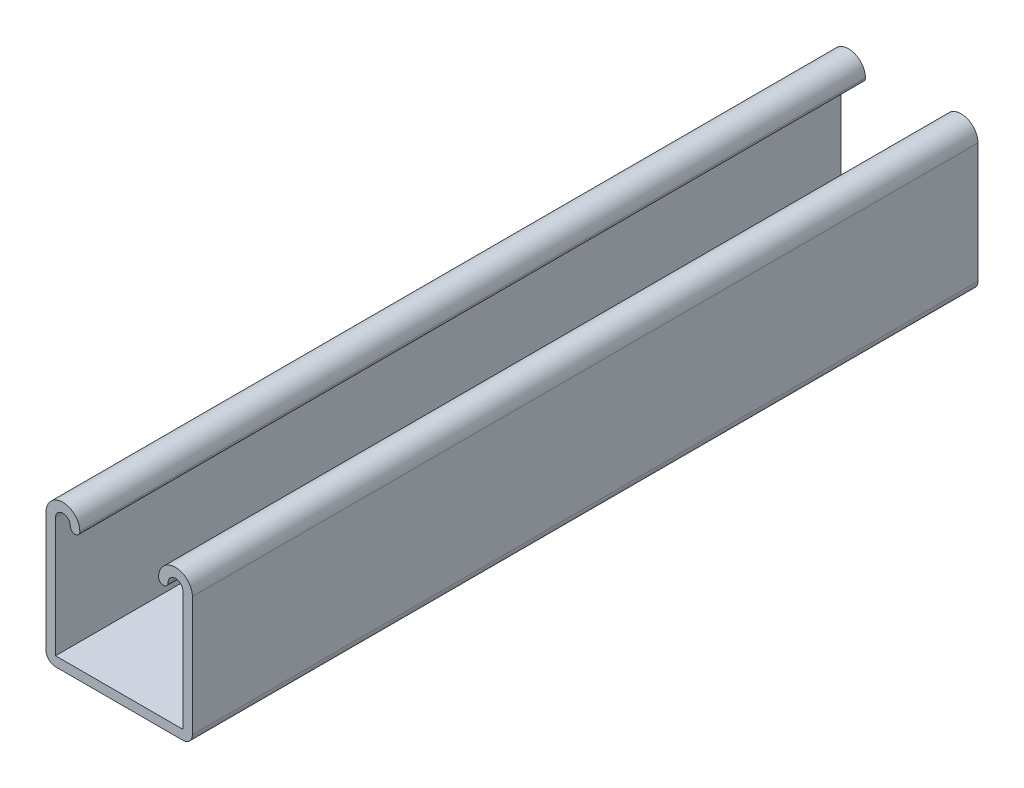
ISO-10303-21;
HEADER;
FILE_DESCRIPTION(('STEP AP214'),'2;1');
FILE_NAME('part.step','',(''),(''),'','','');
FILE_SCHEMA(('AUTOMOTIVE_DESIGN { 1 0 10303 214 1 1 1 1 }'));
ENDSEC;
DATA;
#1=APPLICATION_CONTEXT('core data for automotive mechanical design processes');
#2=APPLICATION_PROTOCOL_DEFINITION('international standard','automotive_design',2000,#1);
#3=PRODUCT_CONTEXT('',#1,'mechanical');
#4=PRODUCT('Part','Part','',(#3));
#5=PRODUCT_RELATED_PRODUCT_CATEGORY('part','',(#4));
#6=PRODUCT_DEFINITION_FORMATION('','',#4);
#7=PRODUCT_DEFINITION_CONTEXT('part definition',#1,'design');
#8=PRODUCT_DEFINITION('design','',#6,#7);
#9=PRODUCT_DEFINITION_SHAPE('','',#8);
#10=(LENGTH_UNIT() NAMED_UNIT(*) SI_UNIT(.MILLI.,.METRE.));
#11=(NAMED_UNIT(*) PLANE_ANGLE_UNIT() SI_UNIT($,.RADIAN.));
#12=(NAMED_UNIT(*) SI_UNIT($,.STERADIAN.) SOLID_ANGLE_UNIT());
#13=UNCERTAINTY_MEASURE_WITH_UNIT(LENGTH_MEASURE(1.E-05),#10,'distance_accuracy_value','');
#14=(GEOMETRIC_REPRESENTATION_CONTEXT(3) GLOBAL_UNCERTAINTY_ASSIGNED_CONTEXT((#13)) GLOBAL_UNIT_ASSIGNED_CONTEXT((#10,
#11,#12)) REPRESENTATION_CONTEXT('',''));
#15=CARTESIAN_POINT('',(0.,0.,0.));
#16=DIRECTION('',(0.,0.,1.));
#17=DIRECTION('',(1.,0.,0.));
#18=AXIS2_PLACEMENT_3D('',#15,#16,#17);
#19=CARTESIAN_POINT('',(0.,2.6924,221.996));
#20=DIRECTION('',(0.,0.,-1.));
#21=DIRECTION('',(-1.,0.,0.));
#22=AXIS2_PLACEMENT_3D('',#19,#20,#21);
#23=CYLINDRICAL_SURFACE('',#22,2.6924);
#24=CARTESIAN_POINT('',(0.,2.6924,0.));
#25=DIRECTION('',(0.,0.,1.));
#26=DIRECTION('',(-1.,0.,0.));
#27=AXIS2_PLACEMENT_3D('',#24,#25,#26);
#28=CIRCLE('',#27,2.6924);
#29=CARTESIAN_POINT('',(-2.6924,2.6924,0.));
#30=VERTEX_POINT('',#29);
#31=CARTESIAN_POINT('',(0.,0.,0.));
#32=VERTEX_POINT('',#31);
#33=EDGE_CURVE('E165',#30,#32,#28,.T.);
#34=ORIENTED_EDGE('',*,*,#33,.T.);
#35=DIRECTION('',(0.,0.,-1.));
#36=VECTOR('',#35,1.);
#37=CARTESIAN_POINT('',(0.,0.,221.996));
#38=LINE('',#37,#36);
#39=CARTESIAN_POINT('',(0.,0.,221.996));
#40=VERTEX_POINT('',#39);
#41=EDGE_CURVE('E11',#40,#32,#38,.T.);
#42=ORIENTED_EDGE('',*,*,#41,.F.);
#43=CARTESIAN_POINT('',(0.,2.6924,221.996));
#44=DIRECTION('',(0.,0.,1.));
#45=DIRECTION('',(-1.,0.,0.));
#46=AXIS2_PLACEMENT_3D('',#43,#44,#45);
#47=CIRCLE('',#46,2.6924);
#48=CARTESIAN_POINT('',(-2.6924,2.6924,221.996));
#49=VERTEX_POINT('',#48);
#50=EDGE_CURVE('E191',#49,#40,#47,.T.);
#51=ORIENTED_EDGE('',*,*,#50,.F.);
#52=DIRECTION('',(0.,0.,-1.));
#53=VECTOR('',#52,1.);
#54=CARTESIAN_POINT('',(-2.6924,2.6924,221.996));
#55=LINE('',#54,#53);
#56=EDGE_CURVE('E161',#49,#30,#55,.T.);
#57=ORIENTED_EDGE('',*,*,#56,.T.);
#58=EDGE_LOOP('',(#34,#42,#51,#57));
#59=FACE_BOUND('',#58,.T.);
#60=ADVANCED_FACE('F33',(#59),#23,.T.);
#61=CARTESIAN_POINT('',(0.,0.,221.996));
#62=DIRECTION('',(0.,1.,0.));
#63=DIRECTION('',(0.,0.,1.));
#64=AXIS2_PLACEMENT_3D('',#61,#62,#63);
#65=PLANE('',#64);
#66=DIRECTION('',(1.,0.,0.));
#67=VECTOR('',#66,1.);
#68=CARTESIAN_POINT('',(0.,0.,0.));
#69=LINE('',#68,#67);
#70=CARTESIAN_POINT('',(35.98,0.,0.));
#71=VERTEX_POINT('',#70);
#72=EDGE_CURVE('E168',#32,#71,#69,.T.);
#73=ORIENTED_EDGE('',*,*,#72,.T.);
#74=DIRECTION('',(0.,0.,-1.));
#75=VECTOR('',#74,1.);
#76=CARTESIAN_POINT('',(35.98,0.,221.996));
#77=LINE('',#76,#75);
#78=CARTESIAN_POINT('',(35.98,0.,221.996));
#79=VERTEX_POINT('',#78);
#80=EDGE_CURVE('E41',#79,#71,#77,.T.);
#81=ORIENTED_EDGE('',*,*,#80,.F.);
#82=DIRECTION('',(1.,0.,0.));
#83=VECTOR('',#82,1.);
#84=CARTESIAN_POINT('',(0.,0.,221.996));
#85=LINE('',#84,#83);
#86=EDGE_CURVE('E110',#40,#79,#85,.T.);
#87=ORIENTED_EDGE('',*,*,#86,.F.);
#88=ORIENTED_EDGE('',*,*,#41,.T.);
#89=EDGE_LOOP('',(#73,#81,#87,#88));
#90=FACE_BOUND('',#89,.T.);
#91=ADVANCED_FACE('F279',(#90),#65,.F.);
#92=CARTESIAN_POINT('',(35.98,2.6924,221.996));
#93=DIRECTION('',(0.,0.,-1.));
#94=DIRECTION('',(-1.,0.,0.));
#95=AXIS2_PLACEMENT_3D('',#92,#93,#94);
#96=CYLINDRICAL_SURFACE('',#95,2.6924);
#97=CARTESIAN_POINT('',(35.98,2.6924,0.));
#98=DIRECTION('',(0.,0.,1.));
#99=DIRECTION('',(1.,0.,0.));
#100=AXIS2_PLACEMENT_3D('',#97,#98,#99);
#101=CIRCLE('',#100,2.6924);
#102=CARTESIAN_POINT('',(38.6724,2.6924,0.));
#103=VERTEX_POINT('',#102);
#104=EDGE_CURVE('E170',#71,#103,#101,.T.);
#105=ORIENTED_EDGE('',*,*,#104,.T.);
#106=DIRECTION('',(0.,0.,-1.));
#107=VECTOR('',#106,1.);
#108=CARTESIAN_POINT('',(38.6724,2.6924,221.996));
#109=LINE('',#108,#107);
#110=CARTESIAN_POINT('',(38.6724,2.6924,221.996));
#111=VERTEX_POINT('',#110);
#112=EDGE_CURVE('E216',#111,#103,#109,.T.);
#113=ORIENTED_EDGE('',*,*,#112,.F.);
#114=CARTESIAN_POINT('',(35.98,2.6924,221.996));
#115=DIRECTION('',(0.,0.,1.));
#116=DIRECTION('',(1.,0.,0.));
#117=AXIS2_PLACEMENT_3D('',#114,#115,#116);
#118=CIRCLE('',#117,2.6924);
#119=EDGE_CURVE('E224',#79,#111,#118,.T.);
#120=ORIENTED_EDGE('',*,*,#119,.F.);
#121=ORIENTED_EDGE('',*,*,#80,.T.);
#122=EDGE_LOOP('',(#105,#113,#120,#121));
#123=FACE_BOUND('',#122,.T.);
#124=ADVANCED_FACE('F222',(#123),#96,.T.);
#125=CARTESIAN_POINT('',(38.6724,2.6924,221.996));
#126=DIRECTION('',(-1.,0.,0.));
#127=DIRECTION('',(0.,0.,1.));
#128=AXIS2_PLACEMENT_3D('',#125,#126,#127);
#129=PLANE('',#128);
#130=DIRECTION('',(0.,1.,0.));
#131=VECTOR('',#130,1.);
#132=CARTESIAN_POINT('',(38.6724,2.6924,0.));
#133=LINE('',#132,#131);
#134=CARTESIAN_POINT('',(38.6724,36.5252,0.));
#135=VERTEX_POINT('',#134);
#136=EDGE_CURVE('E172',#103,#135,#133,.T.);
#137=ORIENTED_EDGE('',*,*,#136,.T.);
#138=DIRECTION('',(0.,0.,-1.));
#139=VECTOR('',#138,1.);
#140=CARTESIAN_POINT('',(38.6724,36.5252,221.996));
#141=LINE('',#140,#139);
#142=CARTESIAN_POINT('',(38.6724,36.5252,221.996));
#143=VERTEX_POINT('',#142);
#144=EDGE_CURVE('E213',#143,#135,#141,.T.);
#145=ORIENTED_EDGE('',*,*,#144,.F.);
#146=DIRECTION('',(0.,1.,0.));
#147=VECTOR('',#146,1.);
#148=CARTESIAN_POINT('',(38.6724,2.6924,221.996));
#149=LINE('',#148,#147);
#150=EDGE_CURVE('E242',#111,#143,#149,.T.);
#151=ORIENTED_EDGE('',*,*,#150,.F.);
#152=ORIENTED_EDGE('',*,*,#112,.T.);
#153=EDGE_LOOP('',(#137,#145,#151,#152));
#154=FACE_BOUND('',#153,.T.);
#155=ADVANCED_FACE('F233',(#154),#129,.F.);
#156=CARTESIAN_POINT('',(33.8972,36.5252,221.996));
#157=DIRECTION('',(0.,0.,-1.));
#158=DIRECTION('',(-1.,0.,0.));
#159=AXIS2_PLACEMENT_3D('',#156,#157,#158);
#160=CYLINDRICAL_SURFACE('',#159,4.7752);
#161=CARTESIAN_POINT('',(33.8972,36.5252,0.));
#162=DIRECTION('',(0.,0.,1.));
#163=DIRECTION('',(1.,0.,0.));
#164=AXIS2_PLACEMENT_3D('',#161,#162,#163);
#165=CIRCLE('',#164,4.7752);
#166=CARTESIAN_POINT('',(29.122,36.5252,0.));
#167=VERTEX_POINT('',#166);
#168=EDGE_CURVE('E174',#135,#167,#165,.T.);
#169=ORIENTED_EDGE('',*,*,#168,.T.);
#170=DIRECTION('',(0.,0.,-1.));
#171=VECTOR('',#170,1.);
#172=CARTESIAN_POINT('',(29.122,36.5252,221.996));
#173=LINE('',#172,#171);
#174=CARTESIAN_POINT('',(29.122,36.5252,221.996));
#175=VERTEX_POINT('',#174);
#176=EDGE_CURVE('E210',#175,#167,#173,.T.);
#177=ORIENTED_EDGE('',*,*,#176,.F.);
#178=CARTESIAN_POINT('',(33.8972,36.5252,221.996));
#179=DIRECTION('',(0.,0.,1.));
#180=DIRECTION('',(1.,0.,0.));
#181=AXIS2_PLACEMENT_3D('',#178,#179,#180);
#182=CIRCLE('',#181,4.7752);
#183=EDGE_CURVE('E239',#143,#175,#182,.T.);
#184=ORIENTED_EDGE('',*,*,#183,.F.);
#185=ORIENTED_EDGE('',*,*,#144,.T.);
#186=EDGE_LOOP('',(#169,#177,#184,#185));
#187=FACE_BOUND('',#186,.T.);
#188=ADVANCED_FACE('F237',(#187),#160,.T.);
#189=CARTESIAN_POINT('',(30.4682,36.5252,221.996));
#190=DIRECTION('',(0.,0.,-1.));
#191=DIRECTION('',(-1.,0.,0.));
#192=AXIS2_PLACEMENT_3D('',#189,#190,#191);
#193=CYLINDRICAL_SURFACE('',#192,1.3462);
#194=CARTESIAN_POINT('',(30.4682,36.5252,0.));
#195=DIRECTION('',(0.,0.,1.));
#196=DIRECTION('',(1.,0.,0.));
#197=AXIS2_PLACEMENT_3D('',#194,#195,#196);
#198=CIRCLE('',#197,1.3462);
#199=CARTESIAN_POINT('',(31.8144,36.5252,0.));
#200=VERTEX_POINT('',#199);
#201=EDGE_CURVE('E176',#167,#200,#198,.T.);
#202=ORIENTED_EDGE('',*,*,#201,.T.);
#203=DIRECTION('',(0.,0.,-1.));
#204=VECTOR('',#203,1.);
#205=CARTESIAN_POINT('',(31.8144,36.5252,221.996));
#206=LINE('',#205,#204);
#207=CARTESIAN_POINT('',(31.8144,36.5252,221.996));
#208=VERTEX_POINT('',#207);
#209=EDGE_CURVE('E207',#208,#200,#206,.T.);
#210=ORIENTED_EDGE('',*,*,#209,.F.);
#211=CARTESIAN_POINT('',(30.4682,36.5252,221.996));
#212=DIRECTION('',(0.,0.,1.));
#213=DIRECTION('',(1.,0.,0.));
#214=AXIS2_PLACEMENT_3D('',#211,#212,#213);
#215=CIRCLE('',#214,1.3462);
#216=EDGE_CURVE('E241',#175,#208,#215,.T.);
#217=ORIENTED_EDGE('',*,*,#216,.F.);
#218=ORIENTED_EDGE('',*,*,#176,.T.);
#219=EDGE_LOOP('',(#202,#210,#217,#218));
#220=FACE_BOUND('',#219,.T.);
#221=ADVANCED_FACE('F292',(#220),#193,.T.);
#222=CARTESIAN_POINT('',(33.8972,36.5252,221.996));
#223=DIRECTION('',(0.,0.,-1.));
#224=DIRECTION('',(-1.,0.,0.));
#225=AXIS2_PLACEMENT_3D('',#222,#223,#224);
#226=CYLINDRICAL_SURFACE('',#225,2.0828);
#227=CARTESIAN_POINT('',(33.8972,36.5252,0.));
#228=DIRECTION('',(0.,0.,-1.));
#229=DIRECTION('',(1.,0.,0.));
#230=AXIS2_PLACEMENT_3D('',#227,#228,#229);
#231=CIRCLE('',#230,2.0828);
#232=CARTESIAN_POINT('',(35.98,36.5252,0.));
#233=VERTEX_POINT('',#232);
#234=EDGE_CURVE('E178',#200,#233,#231,.T.);
#235=ORIENTED_EDGE('',*,*,#234,.T.);
#236=DIRECTION('',(0.,0.,-1.));
#237=VECTOR('',#236,1.);
#238=CARTESIAN_POINT('',(35.98,36.5252,221.996));
#239=LINE('',#238,#237);
#240=CARTESIAN_POINT('',(35.98,36.5252,221.996));
#241=VERTEX_POINT('',#240);
#242=EDGE_CURVE('E204',#241,#233,#239,.T.);
#243=ORIENTED_EDGE('',*,*,#242,.F.);
#244=CARTESIAN_POINT('',(33.8972,36.5252,221.996));
#245=DIRECTION('',(0.,0.,-1.));
#246=DIRECTION('',(1.,0.,0.));
#247=AXIS2_PLACEMENT_3D('',#244,#245,#246);
#248=CIRCLE('',#247,2.0828);
#249=EDGE_CURVE('E244',#208,#241,#248,.T.);
#250=ORIENTED_EDGE('',*,*,#249,.F.);
#251=ORIENTED_EDGE('',*,*,#209,.T.);
#252=EDGE_LOOP('',(#235,#243,#250,#251));
#253=FACE_BOUND('',#252,.T.);
#254=ADVANCED_FACE('F295',(#253),#226,.F.);
#255=CARTESIAN_POINT('',(35.98,2.6924,221.996));
#256=DIRECTION('',(1.,0.,0.));
#257=DIRECTION('',(0.,0.,-1.));
#258=AXIS2_PLACEMENT_3D('',#255,#256,#257);
#259=PLANE('',#258);
#260=DIRECTION('',(0.,-1.,0.));
#261=VECTOR('',#260,1.);
#262=CARTESIAN_POINT('',(35.98,2.6924,0.));
#263=LINE('',#262,#261);
#264=CARTESIAN_POINT('',(35.98,2.6924,0.));
#265=VERTEX_POINT('',#264);
#266=EDGE_CURVE('E180',#233,#265,#263,.T.);
#267=ORIENTED_EDGE('',*,*,#266,.T.);
#268=DIRECTION('',(0.,0.,-1.));
#269=VECTOR('',#268,1.);
#270=CARTESIAN_POINT('',(35.98,2.6924,221.996));
#271=LINE('',#270,#269);
#272=CARTESIAN_POINT('',(35.98,2.6924,221.996));
#273=VERTEX_POINT('',#272);
#274=EDGE_CURVE('E201',#273,#265,#271,.T.);
#275=ORIENTED_EDGE('',*,*,#274,.F.);
#276=DIRECTION('',(0.,-1.,0.));
#277=VECTOR('',#276,1.);
#278=CARTESIAN_POINT('',(35.98,2.6924,221.996));
#279=LINE('',#278,#277);
#280=EDGE_CURVE('E250',#241,#273,#279,.T.);
#281=ORIENTED_EDGE('',*,*,#280,.F.);
#282=ORIENTED_EDGE('',*,*,#242,.T.);
#283=EDGE_LOOP('',(#267,#275,#281,#282));
#284=FACE_BOUND('',#283,.T.);
#285=ADVANCED_FACE('F299',(#284),#259,.F.);
#286=CARTESIAN_POINT('',(35.98,2.6924,221.996));
#287=DIRECTION('',(0.,-1.,0.));
#288=DIRECTION('',(0.,0.,-1.));
#289=AXIS2_PLACEMENT_3D('',#286,#287,#288);
#290=PLANE('',#289);
#291=DIRECTION('',(-1.,0.,0.));
#292=VECTOR('',#291,1.);
#293=CARTESIAN_POINT('',(35.98,2.6924,0.));
#294=LINE('',#293,#292);
#295=CARTESIAN_POINT('',(0.,2.6924,0.));
#296=VERTEX_POINT('',#295);
#297=EDGE_CURVE('E182',#265,#296,#294,.T.);
#298=ORIENTED_EDGE('',*,*,#297,.T.);
#299=DIRECTION('',(0.,0.,-1.));
#300=VECTOR('',#299,1.);
#301=CARTESIAN_POINT('',(0.,2.6924,221.996));
#302=LINE('',#301,#300);
#303=CARTESIAN_POINT('',(0.,2.6924,221.996));
#304=VERTEX_POINT('',#303);
#305=EDGE_CURVE('E198',#304,#296,#302,.T.);
#306=ORIENTED_EDGE('',*,*,#305,.F.);
#307=DIRECTION('',(-1.,0.,0.));
#308=VECTOR('',#307,1.);
#309=CARTESIAN_POINT('',(35.98,2.6924,221.996));
#310=LINE('',#309,#308);
#311=EDGE_CURVE('E252',#273,#304,#310,.T.);
#312=ORIENTED_EDGE('',*,*,#311,.F.);
#313=ORIENTED_EDGE('',*,*,#274,.T.);
#314=EDGE_LOOP('',(#298,#306,#312,#313));
#315=FACE_BOUND('',#314,.T.);
#316=ADVANCED_FACE('F303',(#315),#290,.F.);
#317=CARTESIAN_POINT('',(0.,2.6924,221.996));
#318=DIRECTION('',(-1.,0.,0.));
#319=DIRECTION('',(0.,0.,1.));
#320=AXIS2_PLACEMENT_3D('',#317,#318,#319);
#321=PLANE('',#320);
#322=DIRECTION('',(0.,1.,0.));
#323=VECTOR('',#322,1.);
#324=CARTESIAN_POINT('',(0.,2.6924,0.));
#325=LINE('',#324,#323);
#326=CARTESIAN_POINT('',(0.,36.5252,0.));
#327=VERTEX_POINT('',#326);
#328=EDGE_CURVE('E184',#296,#327,#325,.T.);
#329=ORIENTED_EDGE('',*,*,#328,.T.);
#330=DIRECTION('',(0.,0.,-1.));
#331=VECTOR('',#330,1.);
#332=CARTESIAN_POINT('',(0.,36.5252,221.996));
#333=LINE('',#332,#331);
#334=CARTESIAN_POINT('',(0.,36.5252,221.996));
#335=VERTEX_POINT('',#334);
#336=EDGE_CURVE('E195',#335,#327,#333,.T.);
#337=ORIENTED_EDGE('',*,*,#336,.F.);
#338=DIRECTION('',(0.,1.,0.));
#339=VECTOR('',#338,1.);
#340=CARTESIAN_POINT('',(0.,2.6924,221.996));
#341=LINE('',#340,#339);
#342=EDGE_CURVE('E254',#304,#335,#341,.T.);
#343=ORIENTED_EDGE('',*,*,#342,.F.);
#344=ORIENTED_EDGE('',*,*,#305,.T.);
#345=EDGE_LOOP('',(#329,#337,#343,#344));
#346=FACE_BOUND('',#345,.T.);
#347=ADVANCED_FACE('F260',(#346),#321,.F.);
#348=CARTESIAN_POINT('',(2.0828,36.5252,221.996));
#349=DIRECTION('',(0.,0.,-1.));
#350=DIRECTION('',(-1.,0.,0.));
#351=AXIS2_PLACEMENT_3D('',#348,#349,#350);
#352=CYLINDRICAL_SURFACE('',#351,2.0828);
#353=CARTESIAN_POINT('',(2.0828,36.5252,0.));
#354=DIRECTION('',(0.,0.,-1.));
#355=DIRECTION('',(-1.,0.,0.));
#356=AXIS2_PLACEMENT_3D('',#353,#354,#355);
#357=CIRCLE('',#356,2.0828);
#358=CARTESIAN_POINT('',(4.16560000000001,36.5252,0.));
#359=VERTEX_POINT('',#358);
#360=EDGE_CURVE('E186',#327,#359,#357,.T.);
#361=ORIENTED_EDGE('',*,*,#360,.T.);
#362=DIRECTION('',(0.,0.,-1.));
#363=VECTOR('',#362,1.);
#364=CARTESIAN_POINT('',(4.16560000000001,36.5252,221.996));
#365=LINE('',#364,#363);
#366=CARTESIAN_POINT('',(4.16560000000001,36.5252,221.996));
#367=VERTEX_POINT('',#366);
#368=EDGE_CURVE('E156',#367,#359,#365,.T.);
#369=ORIENTED_EDGE('',*,*,#368,.F.);
#370=CARTESIAN_POINT('',(2.0828,36.5252,221.996));
#371=DIRECTION('',(0.,0.,-1.));
#372=DIRECTION('',(-1.,0.,0.));
#373=AXIS2_PLACEMENT_3D('',#370,#371,#372);
#374=CIRCLE('',#373,2.0828);
#375=EDGE_CURVE('E147',#335,#367,#374,.T.);
#376=ORIENTED_EDGE('',*,*,#375,.F.);
#377=ORIENTED_EDGE('',*,*,#336,.T.);
#378=EDGE_LOOP('',(#361,#369,#376,#377));
#379=FACE_BOUND('',#378,.T.);
#380=ADVANCED_FACE('F264',(#379),#352,.F.);
#381=CARTESIAN_POINT('',(5.5118,36.5252,221.996));
#382=DIRECTION('',(0.,0.,-1.));
#383=DIRECTION('',(-1.,0.,0.));
#384=AXIS2_PLACEMENT_3D('',#381,#382,#383);
#385=CYLINDRICAL_SURFACE('',#384,1.3462);
#386=CARTESIAN_POINT('',(5.5118,36.5252,0.));
#387=DIRECTION('',(0.,0.,1.));
#388=DIRECTION('',(-1.,0.,0.));
#389=AXIS2_PLACEMENT_3D('',#386,#387,#388);
#390=CIRCLE('',#389,1.3462);
#391=CARTESIAN_POINT('',(6.858,36.5252,0.));
#392=VERTEX_POINT('',#391);
#393=EDGE_CURVE('E155',#359,#392,#390,.T.);
#394=ORIENTED_EDGE('',*,*,#393,.T.);
#395=DIRECTION('',(0.,0.,-1.));
#396=VECTOR('',#395,1.);
#397=CARTESIAN_POINT('',(6.858,36.5252,221.996));
#398=LINE('',#397,#396);
#399=CARTESIAN_POINT('',(6.858,36.5252,221.996));
#400=VERTEX_POINT('',#399);
#401=EDGE_CURVE('E152',#400,#392,#398,.T.);
#402=ORIENTED_EDGE('',*,*,#401,.F.);
#403=CARTESIAN_POINT('',(5.5118,36.5252,221.996));
#404=DIRECTION('',(0.,0.,1.));
#405=DIRECTION('',(-1.,0.,0.));
#406=AXIS2_PLACEMENT_3D('',#403,#404,#405);
#407=CIRCLE('',#406,1.3462);
#408=EDGE_CURVE('E141',#367,#400,#407,.T.);
#409=ORIENTED_EDGE('',*,*,#408,.F.);
#410=ORIENTED_EDGE('',*,*,#368,.T.);
#411=EDGE_LOOP('',(#394,#402,#409,#410));
#412=FACE_BOUND('',#411,.T.);
#413=ADVANCED_FACE('F153',(#412),#385,.T.);
#414=CARTESIAN_POINT('',(2.0828,36.5252,221.996));
#415=DIRECTION('',(0.,0.,-1.));
#416=DIRECTION('',(-1.,0.,0.));
#417=AXIS2_PLACEMENT_3D('',#414,#415,#416);
#418=CYLINDRICAL_SURFACE('',#417,4.7752);
#419=CARTESIAN_POINT('',(2.0828,36.5252,0.));
#420=DIRECTION('',(0.,0.,1.));
#421=DIRECTION('',(-1.,0.,0.));
#422=AXIS2_PLACEMENT_3D('',#419,#420,#421);
#423=CIRCLE('',#422,4.7752);
#424=CARTESIAN_POINT('',(-2.6924,36.5252,0.));
#425=VERTEX_POINT('',#424);
#426=EDGE_CURVE('E96',#392,#425,#423,.T.);
#427=ORIENTED_EDGE('',*,*,#426,.T.);
#428=DIRECTION('',(0.,0.,-1.));
#429=VECTOR('',#428,1.);
#430=CARTESIAN_POINT('',(-2.6924,36.5252,221.996));
#431=LINE('',#430,#429);
#432=CARTESIAN_POINT('',(-2.6924,36.5252,221.996));
#433=VERTEX_POINT('',#432);
#434=EDGE_CURVE('E157',#433,#425,#431,.T.);
#435=ORIENTED_EDGE('',*,*,#434,.F.);
#436=CARTESIAN_POINT('',(2.0828,36.5252,221.996));
#437=DIRECTION('',(0.,0.,1.));
#438=DIRECTION('',(-1.,0.,0.));
#439=AXIS2_PLACEMENT_3D('',#436,#437,#438);
#440=CIRCLE('',#439,4.7752);
#441=EDGE_CURVE('E145',#400,#433,#440,.T.);
#442=ORIENTED_EDGE('',*,*,#441,.F.);
#443=ORIENTED_EDGE('',*,*,#401,.T.);
#444=EDGE_LOOP('',(#427,#435,#442,#443));
#445=FACE_BOUND('',#444,.T.);
#446=ADVANCED_FACE('F159',(#445),#418,.T.);
#447=CARTESIAN_POINT('',(-2.6924,2.6924,221.996));
#448=DIRECTION('',(1.,0.,0.));
#449=DIRECTION('',(0.,0.,-1.));
#450=AXIS2_PLACEMENT_3D('',#447,#448,#449);
#451=PLANE('',#450);
#452=DIRECTION('',(0.,-1.,0.));
#453=VECTOR('',#452,1.);
#454=CARTESIAN_POINT('',(-2.6924,2.6924,0.));
#455=LINE('',#454,#453);
#456=EDGE_CURVE('E102',#425,#30,#455,.T.);
#457=ORIENTED_EDGE('',*,*,#456,.T.);
#458=ORIENTED_EDGE('',*,*,#56,.F.);
#459=DIRECTION('',(0.,-1.,0.));
#460=VECTOR('',#459,1.);
#461=CARTESIAN_POINT('',(-2.6924,2.6924,221.996));
#462=LINE('',#461,#460);
#463=EDGE_CURVE('E49',#433,#49,#462,.T.);
#464=ORIENTED_EDGE('',*,*,#463,.F.);
#465=ORIENTED_EDGE('',*,*,#434,.T.);
#466=EDGE_LOOP('',(#457,#458,#464,#465));
#467=FACE_BOUND('',#466,.T.);
#468=ADVANCED_FACE('F268',(#467),#451,.F.);
#469=CARTESIAN_POINT('',(0.,2.6924,221.996));
#470=DIRECTION('',(0.,0.,-1.));
#471=DIRECTION('',(-1.,0.,0.));
#472=AXIS2_PLACEMENT_3D('',#469,#470,#471);
#473=PLANE('',#472);
#474=ORIENTED_EDGE('',*,*,#50,.T.);
#475=ORIENTED_EDGE('',*,*,#86,.T.);
#476=ORIENTED_EDGE('',*,*,#119,.T.);
#477=ORIENTED_EDGE('',*,*,#150,.T.);
#478=ORIENTED_EDGE('',*,*,#183,.T.);
#479=ORIENTED_EDGE('',*,*,#216,.T.);
#480=ORIENTED_EDGE('',*,*,#249,.T.);
#481=ORIENTED_EDGE('',*,*,#280,.T.);
#482=ORIENTED_EDGE('',*,*,#311,.T.);
#483=ORIENTED_EDGE('',*,*,#342,.T.);
#484=ORIENTED_EDGE('',*,*,#375,.T.);
#485=ORIENTED_EDGE('',*,*,#408,.T.);
#486=ORIENTED_EDGE('',*,*,#441,.T.);
#487=ORIENTED_EDGE('',*,*,#463,.T.);
#488=EDGE_LOOP('',(#474,#475,#476,#477,#478,#479,#480,#481,#482,#483,#484,#485,#486,#487));
#489=FACE_BOUND('',#488,.T.);
#490=ADVANCED_FACE('F143',(#489),#473,.F.);
#491=CARTESIAN_POINT('',(0.,2.6924,0.));
#492=DIRECTION('',(0.,0.,-1.));
#493=DIRECTION('',(-1.,0.,0.));
#494=AXIS2_PLACEMENT_3D('',#491,#492,#493);
#495=PLANE('',#494);
#496=ORIENTED_EDGE('',*,*,#33,.F.);
#497=ORIENTED_EDGE('',*,*,#456,.F.);
#498=ORIENTED_EDGE('',*,*,#426,.F.);
#499=ORIENTED_EDGE('',*,*,#393,.F.);
#500=ORIENTED_EDGE('',*,*,#360,.F.);
#501=ORIENTED_EDGE('',*,*,#328,.F.);
#502=ORIENTED_EDGE('',*,*,#297,.F.);
#503=ORIENTED_EDGE('',*,*,#266,.F.);
#504=ORIENTED_EDGE('',*,*,#234,.F.);
#505=ORIENTED_EDGE('',*,*,#201,.F.);
#506=ORIENTED_EDGE('',*,*,#168,.F.);
#507=ORIENTED_EDGE('',*,*,#136,.F.);
#508=ORIENTED_EDGE('',*,*,#104,.F.);
#509=ORIENTED_EDGE('',*,*,#72,.F.);
#510=EDGE_LOOP('',(#496,#497,#498,#499,#500,#501,#502,#503,#504,#505,#506,#507,#508,#509));
#511=FACE_BOUND('',#510,.T.);
#512=ADVANCED_FACE('F228',(#511),#495,.T.);
#513=CLOSED_SHELL('',(#60,#91,#124,#155,#188,#221,#254,#285,#316,#347,#380,#413,#446,#468,#490,#512));
#514=MANIFOLD_SOLID_BREP('B2',#513);
#515=ADVANCED_BREP_SHAPE_REPRESENTATION('',(#18,#514),#14);
#516=SHAPE_DEFINITION_REPRESENTATION(#9,#515);
ENDSEC;
END-ISO-10303-21;
